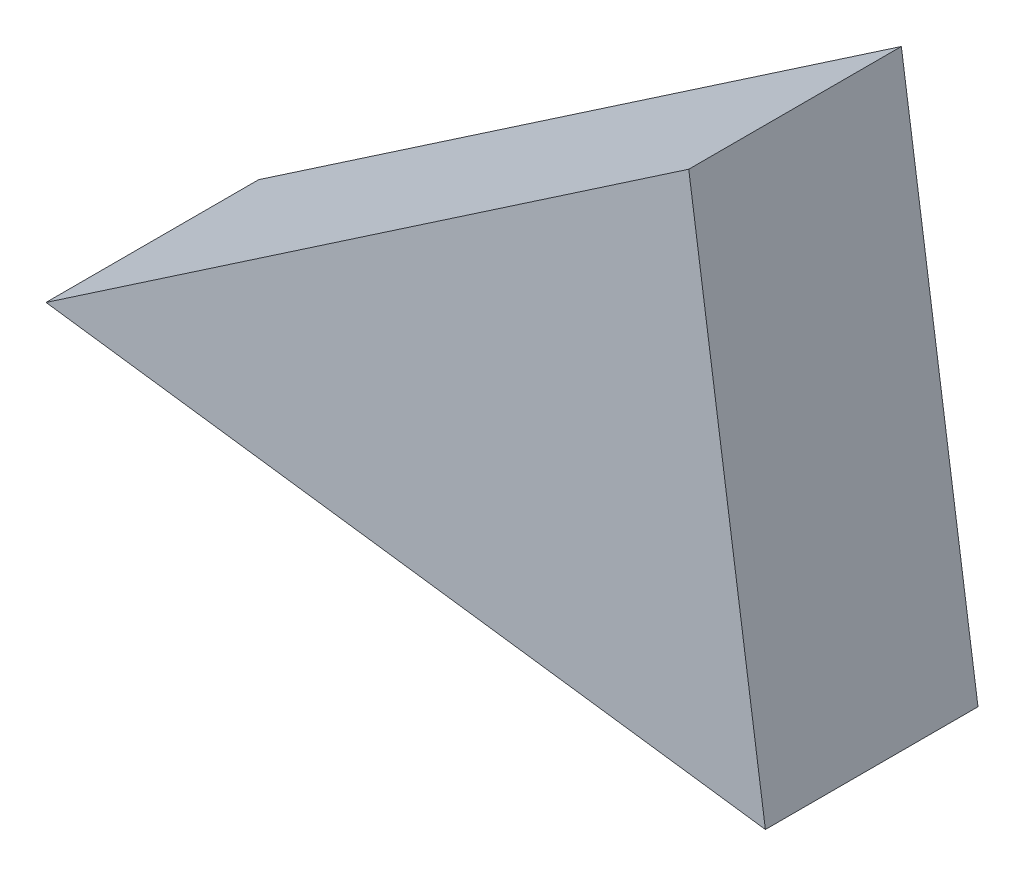
ISO-10303-21;
HEADER;
FILE_DESCRIPTION(('STEP AP214'),'2;1');
FILE_NAME('part.step','',(''),(''),'','','');
FILE_SCHEMA(('AUTOMOTIVE_DESIGN { 1 0 10303 214 1 1 1 1 }'));
ENDSEC;
DATA;
#1=APPLICATION_CONTEXT('core data for automotive mechanical design processes');
#2=APPLICATION_PROTOCOL_DEFINITION('international standard','automotive_design',2000,#1);
#3=PRODUCT_CONTEXT('',#1,'mechanical');
#4=PRODUCT('Part','Part','',(#3));
#5=PRODUCT_RELATED_PRODUCT_CATEGORY('part','',(#4));
#6=PRODUCT_DEFINITION_FORMATION('','',#4);
#7=PRODUCT_DEFINITION_CONTEXT('part definition',#1,'design');
#8=PRODUCT_DEFINITION('design','',#6,#7);
#9=PRODUCT_DEFINITION_SHAPE('','',#8);
#10=(LENGTH_UNIT() NAMED_UNIT(*) SI_UNIT(.MILLI.,.METRE.));
#11=(NAMED_UNIT(*) PLANE_ANGLE_UNIT() SI_UNIT($,.RADIAN.));
#12=(NAMED_UNIT(*) SI_UNIT($,.STERADIAN.) SOLID_ANGLE_UNIT());
#13=UNCERTAINTY_MEASURE_WITH_UNIT(LENGTH_MEASURE(1.E-05),#10,'distance_accuracy_value','');
#14=(GEOMETRIC_REPRESENTATION_CONTEXT(3) GLOBAL_UNCERTAINTY_ASSIGNED_CONTEXT((#13)) GLOBAL_UNIT_ASSIGNED_CONTEXT((#10,
#11,#12)) REPRESENTATION_CONTEXT('',''));
#15=CARTESIAN_POINT('',(0.,0.,0.));
#16=DIRECTION('',(0.,0.,1.));
#17=DIRECTION('',(1.,0.,0.));
#18=AXIS2_PLACEMENT_3D('',#15,#16,#17);
#19=CARTESIAN_POINT('',(66.450886489875,44.2875954884627,10.));
#20=DIRECTION('',(-0.989836811622139,-0.142207898366156,0.));
#21=DIRECTION('',(0.142207898366156,-0.989836811622139,0.));
#22=AXIS2_PLACEMENT_3D('',#19,#20,#21);
#23=PLANE('',#22);
#24=DIRECTION('',(-0.142207898366156,0.989836811622138,0.));
#25=VECTOR('',#24,1.);
#26=CARTESIAN_POINT('',(66.450886489875,44.2875954884627,0.));
#27=LINE('',#26,#25);
#28=CARTESIAN_POINT('',(70.0559145415127,19.1948298021742,0.));
#29=VERTEX_POINT('',#28);
#30=CARTESIAN_POINT('',(66.450886489875,44.2875954884627,0.));
#31=VERTEX_POINT('',#30);
#32=EDGE_CURVE('E82',#29,#31,#27,.T.);
#33=ORIENTED_EDGE('',*,*,#32,.T.);
#34=DIRECTION('',(0.,0.,-1.));
#35=VECTOR('',#34,1.);
#36=CARTESIAN_POINT('',(66.450886489875,44.2875954884627,10.));
#37=LINE('',#36,#35);
#38=CARTESIAN_POINT('',(66.450886489875,44.2875954884627,10.));
#39=VERTEX_POINT('',#38);
#40=EDGE_CURVE('E11',#39,#31,#37,.T.);
#41=ORIENTED_EDGE('',*,*,#40,.F.);
#42=DIRECTION('',(-0.142207898366156,0.989836811622138,0.));
#43=VECTOR('',#42,1.);
#44=CARTESIAN_POINT('',(66.450886489875,44.2875954884627,10.));
#45=LINE('',#44,#43);
#46=CARTESIAN_POINT('',(70.0559145415127,19.1948298021742,10.));
#47=VERTEX_POINT('',#46);
#48=EDGE_CURVE('E75',#47,#39,#45,.T.);
#49=ORIENTED_EDGE('',*,*,#48,.F.);
#50=DIRECTION('',(0.,0.,-1.));
#51=VECTOR('',#50,1.);
#52=CARTESIAN_POINT('',(70.0559145415127,19.1948298021742,10.));
#53=LINE('',#52,#51);
#54=EDGE_CURVE('E83',#47,#29,#53,.T.);
#55=ORIENTED_EDGE('',*,*,#54,.T.);
#56=EDGE_LOOP('',(#33,#41,#49,#55));
#57=FACE_BOUND('',#56,.T.);
#58=ADVANCED_FACE('F35',(#57),#23,.F.);
#59=CARTESIAN_POINT('',(66.450886489875,44.2875954884627,10.));
#60=DIRECTION('',(0.56201532130882,-0.827126821360633,0.));
#61=DIRECTION('',(0.827126821360633,0.56201532130882,0.));
#62=AXIS2_PLACEMENT_3D('',#59,#60,#61);
#63=PLANE('',#62);
#64=DIRECTION('',(-0.827126821360633,-0.56201532130882,0.));
#65=VECTOR('',#64,1.);
#66=CARTESIAN_POINT('',(66.450886489875,44.2875954884627,0.));
#67=LINE('',#66,#65);
#68=CARTESIAN_POINT('',(36.2209511299341,23.7469886604629,0.));
#69=VERTEX_POINT('',#68);
#70=EDGE_CURVE('E63',#31,#69,#67,.T.);
#71=ORIENTED_EDGE('',*,*,#70,.T.);
#72=DIRECTION('',(0.,0.,-1.));
#73=VECTOR('',#72,1.);
#74=CARTESIAN_POINT('',(36.2209511299341,23.7469886604629,10.));
#75=LINE('',#74,#73);
#76=CARTESIAN_POINT('',(36.2209511299341,23.7469886604629,10.));
#77=VERTEX_POINT('',#76);
#78=EDGE_CURVE('E43',#77,#69,#75,.T.);
#79=ORIENTED_EDGE('',*,*,#78,.F.);
#80=DIRECTION('',(-0.827126821360633,-0.56201532130882,0.));
#81=VECTOR('',#80,1.);
#82=CARTESIAN_POINT('',(66.450886489875,44.2875954884627,10.));
#83=LINE('',#82,#81);
#84=EDGE_CURVE('E71',#39,#77,#83,.T.);
#85=ORIENTED_EDGE('',*,*,#84,.F.);
#86=ORIENTED_EDGE('',*,*,#40,.T.);
#87=EDGE_LOOP('',(#71,#79,#85,#86));
#88=FACE_BOUND('',#87,.T.);
#89=ADVANCED_FACE('F72',(#88),#63,.F.);
#90=CARTESIAN_POINT('',(70.0559145415127,19.1948298021742,10.));
#91=DIRECTION('',(0.133338712961372,0.991070526060484,0.));
#92=DIRECTION('',(-0.991070526060484,0.133338712961372,0.));
#93=AXIS2_PLACEMENT_3D('',#90,#91,#92);
#94=PLANE('',#93);
#95=DIRECTION('',(0.991070526060484,-0.133338712961372,0.));
#96=VECTOR('',#95,1.);
#97=CARTESIAN_POINT('',(70.0559145415127,19.1948298021742,0.));
#98=LINE('',#97,#96);
#99=EDGE_CURVE('E68',#69,#29,#98,.T.);
#100=ORIENTED_EDGE('',*,*,#99,.T.);
#101=ORIENTED_EDGE('',*,*,#54,.F.);
#102=DIRECTION('',(0.991070526060484,-0.133338712961372,0.));
#103=VECTOR('',#102,1.);
#104=CARTESIAN_POINT('',(70.0559145415127,19.1948298021742,10.));
#105=LINE('',#104,#103);
#106=EDGE_CURVE('E51',#77,#47,#105,.T.);
#107=ORIENTED_EDGE('',*,*,#106,.F.);
#108=ORIENTED_EDGE('',*,*,#78,.T.);
#109=EDGE_LOOP('',(#100,#101,#107,#108));
#110=FACE_BOUND('',#109,.T.);
#111=ADVANCED_FACE('F90',(#110),#94,.F.);
#112=CARTESIAN_POINT('',(0.,0.,10.));
#113=DIRECTION('',(0.,0.,-1.));
#114=DIRECTION('',(-1.,0.,0.));
#115=AXIS2_PLACEMENT_3D('',#112,#113,#114);
#116=PLANE('',#115);
#117=ORIENTED_EDGE('',*,*,#48,.T.);
#118=ORIENTED_EDGE('',*,*,#84,.T.);
#119=ORIENTED_EDGE('',*,*,#106,.T.);
#120=EDGE_LOOP('',(#117,#118,#119));
#121=FACE_BOUND('',#120,.T.);
#122=ADVANCED_FACE('F78',(#121),#116,.F.);
#123=CARTESIAN_POINT('',(0.,0.,0.));
#124=DIRECTION('',(0.,0.,-1.));
#125=DIRECTION('',(-1.,0.,0.));
#126=AXIS2_PLACEMENT_3D('',#123,#124,#125);
#127=PLANE('',#126);
#128=ORIENTED_EDGE('',*,*,#32,.F.);
#129=ORIENTED_EDGE('',*,*,#99,.F.);
#130=ORIENTED_EDGE('',*,*,#70,.F.);
#131=EDGE_LOOP('',(#128,#129,#130));
#132=FACE_BOUND('',#131,.T.);
#133=ADVANCED_FACE('F91',(#132),#127,.T.);
#134=CLOSED_SHELL('',(#58,#89,#111,#122,#133));
#135=MANIFOLD_SOLID_BREP('B2',#134);
#136=ADVANCED_BREP_SHAPE_REPRESENTATION('',(#18,#135),#14);
#137=SHAPE_DEFINITION_REPRESENTATION(#9,#136);
ENDSEC;
END-ISO-10303-21;
